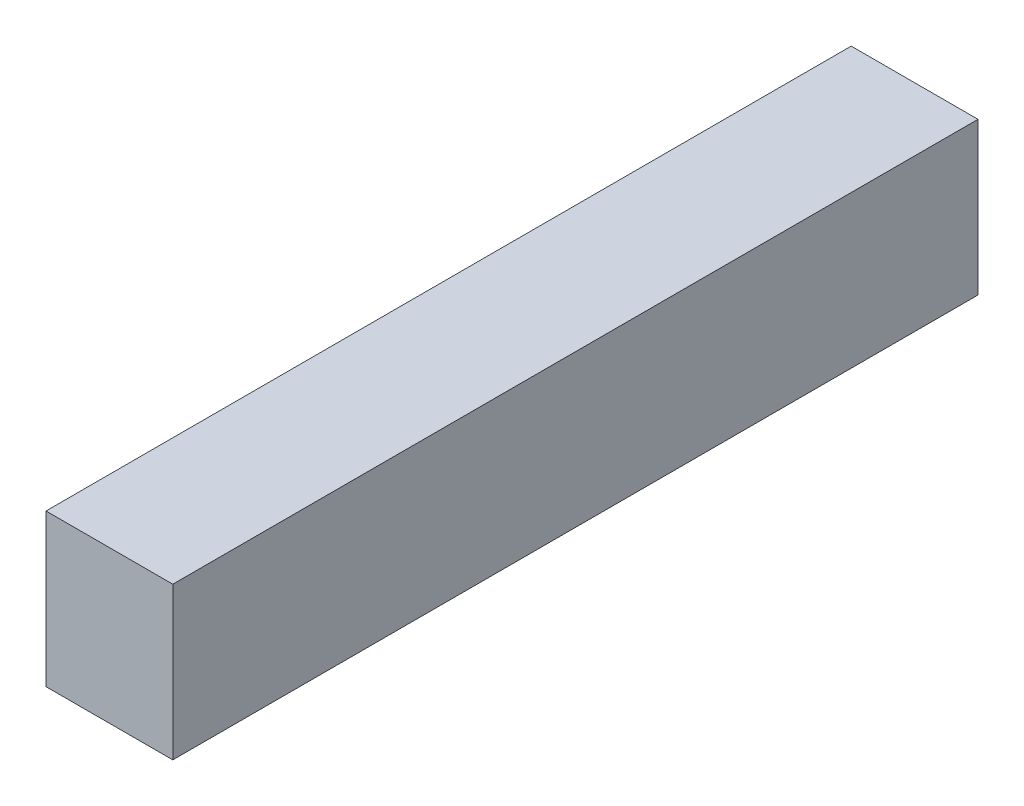
ISO-10303-21;
HEADER;
FILE_DESCRIPTION(('STEP AP214'),'2;1');
FILE_NAME('part.step','',(''),(''),'','','');
FILE_SCHEMA(('AUTOMOTIVE_DESIGN { 1 0 10303 214 1 1 1 1 }'));
ENDSEC;
DATA;
#1=APPLICATION_CONTEXT('core data for automotive mechanical design processes');
#2=APPLICATION_PROTOCOL_DEFINITION('international standard','automotive_design',2000,#1);
#3=PRODUCT_CONTEXT('',#1,'mechanical');
#4=PRODUCT('Part','Part','',(#3));
#5=PRODUCT_RELATED_PRODUCT_CATEGORY('part','',(#4));
#6=PRODUCT_DEFINITION_FORMATION('','',#4);
#7=PRODUCT_DEFINITION_CONTEXT('part definition',#1,'design');
#8=PRODUCT_DEFINITION('design','',#6,#7);
#9=PRODUCT_DEFINITION_SHAPE('','',#8);
#10=(LENGTH_UNIT() NAMED_UNIT(*) SI_UNIT(.MILLI.,.METRE.));
#11=(NAMED_UNIT(*) PLANE_ANGLE_UNIT() SI_UNIT($,.RADIAN.));
#12=(NAMED_UNIT(*) SI_UNIT($,.STERADIAN.) SOLID_ANGLE_UNIT());
#13=UNCERTAINTY_MEASURE_WITH_UNIT(LENGTH_MEASURE(1.E-05),#10,'distance_accuracy_value','');
#14=(GEOMETRIC_REPRESENTATION_CONTEXT(3) GLOBAL_UNCERTAINTY_ASSIGNED_CONTEXT((#13)) GLOBAL_UNIT_ASSIGNED_CONTEXT((#10,
#11,#12)) REPRESENTATION_CONTEXT('',''));
#15=CARTESIAN_POINT('',(0.,0.,0.));
#16=DIRECTION('',(0.,0.,1.));
#17=DIRECTION('',(1.,0.,0.));
#18=AXIS2_PLACEMENT_3D('',#15,#16,#17);
#19=CARTESIAN_POINT('',(-1.,1.2,12.7));
#20=DIRECTION('',(0.,1.,0.));
#21=DIRECTION('',(0.,0.,1.));
#22=AXIS2_PLACEMENT_3D('',#19,#20,#21);
#23=PLANE('',#22);
#24=DIRECTION('',(1.,0.,0.));
#25=VECTOR('',#24,1.);
#26=CARTESIAN_POINT('',(-1.,1.2,0.));
#27=LINE('',#26,#25);
#28=CARTESIAN_POINT('',(-1.,1.2,0.));
#29=VERTEX_POINT('',#28);
#30=CARTESIAN_POINT('',(1.,1.2,0.));
#31=VERTEX_POINT('',#30);
#32=EDGE_CURVE('E110',#29,#31,#27,.T.);
#33=ORIENTED_EDGE('',*,*,#32,.F.);
#34=DIRECTION('',(0.,0.,-1.));
#35=VECTOR('',#34,1.);
#36=CARTESIAN_POINT('',(-1.,1.2,12.7));
#37=LINE('',#36,#35);
#38=CARTESIAN_POINT('',(-1.,1.2,12.7));
#39=VERTEX_POINT('',#38);
#40=EDGE_CURVE('E11',#39,#29,#37,.T.);
#41=ORIENTED_EDGE('',*,*,#40,.F.);
#42=DIRECTION('',(1.,0.,0.));
#43=VECTOR('',#42,1.);
#44=CARTESIAN_POINT('',(-1.,1.2,12.7));
#45=LINE('',#44,#43);
#46=CARTESIAN_POINT('',(1.,1.2,12.7));
#47=VERTEX_POINT('',#46);
#48=EDGE_CURVE('E103',#39,#47,#45,.T.);
#49=ORIENTED_EDGE('',*,*,#48,.T.);
#50=DIRECTION('',(0.,0.,-1.));
#51=VECTOR('',#50,1.);
#52=CARTESIAN_POINT('',(1.,1.2,12.7));
#53=LINE('',#52,#51);
#54=EDGE_CURVE('E42',#47,#31,#53,.T.);
#55=ORIENTED_EDGE('',*,*,#54,.T.);
#56=EDGE_LOOP('',(#33,#41,#49,#55));
#57=FACE_BOUND('',#56,.T.);
#58=ADVANCED_FACE('F39',(#57),#23,.T.);
#59=CARTESIAN_POINT('',(-1.,1.2,12.7));
#60=DIRECTION('',(1.,0.,0.));
#61=DIRECTION('',(0.,1.,0.));
#62=AXIS2_PLACEMENT_3D('',#59,#60,#61);
#63=PLANE('',#62);
#64=DIRECTION('',(0.,-1.,0.));
#65=VECTOR('',#64,1.);
#66=CARTESIAN_POINT('',(-1.,1.2,0.));
#67=LINE('',#66,#65);
#68=CARTESIAN_POINT('',(-1.,-1.2,0.));
#69=VERTEX_POINT('',#68);
#70=EDGE_CURVE('E73',#29,#69,#67,.T.);
#71=ORIENTED_EDGE('',*,*,#70,.T.);
#72=DIRECTION('',(0.,0.,-1.));
#73=VECTOR('',#72,1.);
#74=CARTESIAN_POINT('',(-1.,-1.2,12.7));
#75=LINE('',#74,#73);
#76=CARTESIAN_POINT('',(-1.,-1.2,12.7));
#77=VERTEX_POINT('',#76);
#78=EDGE_CURVE('E49',#77,#69,#75,.T.);
#79=ORIENTED_EDGE('',*,*,#78,.F.);
#80=DIRECTION('',(0.,-1.,0.));
#81=VECTOR('',#80,1.);
#82=CARTESIAN_POINT('',(-1.,1.2,12.7));
#83=LINE('',#82,#81);
#84=EDGE_CURVE('E90',#39,#77,#83,.T.);
#85=ORIENTED_EDGE('',*,*,#84,.F.);
#86=ORIENTED_EDGE('',*,*,#40,.T.);
#87=EDGE_LOOP('',(#71,#79,#85,#86));
#88=FACE_BOUND('',#87,.T.);
#89=ADVANCED_FACE('F126',(#88),#63,.F.);
#90=CARTESIAN_POINT('',(-1.,-1.2,12.7));
#91=DIRECTION('',(0.,1.,0.));
#92=DIRECTION('',(0.,0.,1.));
#93=AXIS2_PLACEMENT_3D('',#90,#91,#92);
#94=PLANE('',#93);
#95=DIRECTION('',(1.,0.,0.));
#96=VECTOR('',#95,1.);
#97=CARTESIAN_POINT('',(-1.,-1.2,0.));
#98=LINE('',#97,#96);
#99=CARTESIAN_POINT('',(1.,-1.2,0.));
#100=VERTEX_POINT('',#99);
#101=EDGE_CURVE('E98',#69,#100,#98,.T.);
#102=ORIENTED_EDGE('',*,*,#101,.T.);
#103=DIRECTION('',(0.,0.,-1.));
#104=VECTOR('',#103,1.);
#105=CARTESIAN_POINT('',(1.,-1.2,12.7));
#106=LINE('',#105,#104);
#107=CARTESIAN_POINT('',(1.,-1.2,12.7));
#108=VERTEX_POINT('',#107);
#109=EDGE_CURVE('E95',#108,#100,#106,.T.);
#110=ORIENTED_EDGE('',*,*,#109,.F.);
#111=DIRECTION('',(1.,0.,0.));
#112=VECTOR('',#111,1.);
#113=CARTESIAN_POINT('',(-1.,-1.2,12.7));
#114=LINE('',#113,#112);
#115=EDGE_CURVE('E85',#77,#108,#114,.T.);
#116=ORIENTED_EDGE('',*,*,#115,.F.);
#117=ORIENTED_EDGE('',*,*,#78,.T.);
#118=EDGE_LOOP('',(#102,#110,#116,#117));
#119=FACE_BOUND('',#118,.T.);
#120=ADVANCED_FACE('F96',(#119),#94,.F.);
#121=CARTESIAN_POINT('',(1.,1.2,12.7));
#122=DIRECTION('',(1.,0.,0.));
#123=DIRECTION('',(0.,0.,-1.));
#124=AXIS2_PLACEMENT_3D('',#121,#122,#123);
#125=PLANE('',#124);
#126=DIRECTION('',(0.,-1.,0.));
#127=VECTOR('',#126,1.);
#128=CARTESIAN_POINT('',(1.,1.2,0.));
#129=LINE('',#128,#127);
#130=EDGE_CURVE('E114',#31,#100,#129,.T.);
#131=ORIENTED_EDGE('',*,*,#130,.F.);
#132=ORIENTED_EDGE('',*,*,#54,.F.);
#133=DIRECTION('',(0.,-1.,0.));
#134=VECTOR('',#133,1.);
#135=CARTESIAN_POINT('',(1.,1.2,12.7));
#136=LINE('',#135,#134);
#137=EDGE_CURVE('E89',#47,#108,#136,.T.);
#138=ORIENTED_EDGE('',*,*,#137,.T.);
#139=ORIENTED_EDGE('',*,*,#109,.T.);
#140=EDGE_LOOP('',(#131,#132,#138,#139));
#141=FACE_BOUND('',#140,.T.);
#142=ADVANCED_FACE('F101',(#141),#125,.T.);
#143=CARTESIAN_POINT('',(0.,0.,12.7));
#144=DIRECTION('',(0.,0.,-1.));
#145=DIRECTION('',(-1.,0.,0.));
#146=AXIS2_PLACEMENT_3D('',#143,#144,#145);
#147=PLANE('',#146);
#148=ORIENTED_EDGE('',*,*,#48,.F.);
#149=ORIENTED_EDGE('',*,*,#84,.T.);
#150=ORIENTED_EDGE('',*,*,#115,.T.);
#151=ORIENTED_EDGE('',*,*,#137,.F.);
#152=EDGE_LOOP('',(#148,#149,#150,#151));
#153=FACE_BOUND('',#152,.T.);
#154=ADVANCED_FACE('F88',(#153),#147,.F.);
#155=CARTESIAN_POINT('',(0.,0.,0.));
#156=DIRECTION('',(0.,0.,-1.));
#157=DIRECTION('',(-1.,0.,0.));
#158=AXIS2_PLACEMENT_3D('',#155,#156,#157);
#159=PLANE('',#158);
#160=ORIENTED_EDGE('',*,*,#32,.T.);
#161=ORIENTED_EDGE('',*,*,#130,.T.);
#162=ORIENTED_EDGE('',*,*,#101,.F.);
#163=ORIENTED_EDGE('',*,*,#70,.F.);
#164=EDGE_LOOP('',(#160,#161,#162,#163));
#165=FACE_BOUND('',#164,.T.);
#166=ADVANCED_FACE('F123',(#165),#159,.T.);
#167=CLOSED_SHELL('',(#58,#89,#120,#142,#154,#166));
#168=MANIFOLD_SOLID_BREP('B2',#167);
#169=ADVANCED_BREP_SHAPE_REPRESENTATION('',(#18,#168),#14);
#170=SHAPE_DEFINITION_REPRESENTATION(#9,#169);
ENDSEC;
END-ISO-10303-21;
